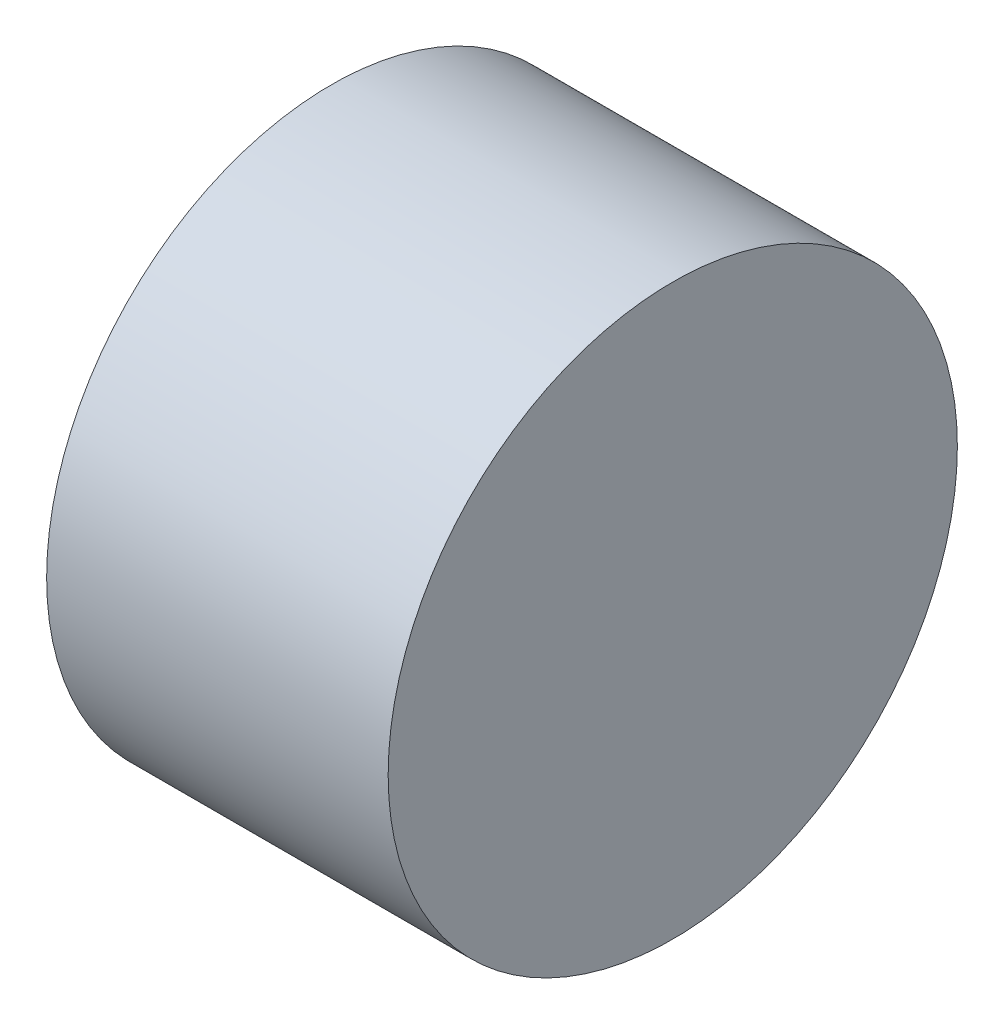
ISO-10303-21;
HEADER;
FILE_DESCRIPTION(('STEP AP214'),'2;1');
FILE_NAME('part.step','',(''),(''),'','','');
FILE_SCHEMA(('AUTOMOTIVE_DESIGN { 1 0 10303 214 1 1 1 1 }'));
ENDSEC;
DATA;
#1=APPLICATION_CONTEXT('core data for automotive mechanical design processes');
#2=APPLICATION_PROTOCOL_DEFINITION('international standard','automotive_design',2000,#1);
#3=PRODUCT_CONTEXT('',#1,'mechanical');
#4=PRODUCT('Part','Part','',(#3));
#5=PRODUCT_RELATED_PRODUCT_CATEGORY('part','',(#4));
#6=PRODUCT_DEFINITION_FORMATION('','',#4);
#7=PRODUCT_DEFINITION_CONTEXT('part definition',#1,'design');
#8=PRODUCT_DEFINITION('design','',#6,#7);
#9=PRODUCT_DEFINITION_SHAPE('','',#8);
#10=(LENGTH_UNIT() NAMED_UNIT(*) SI_UNIT(.MILLI.,.METRE.));
#11=(NAMED_UNIT(*) PLANE_ANGLE_UNIT() SI_UNIT($,.RADIAN.));
#12=(NAMED_UNIT(*) SI_UNIT($,.STERADIAN.) SOLID_ANGLE_UNIT());
#13=UNCERTAINTY_MEASURE_WITH_UNIT(LENGTH_MEASURE(1.E-05),#10,'distance_accuracy_value','');
#14=(GEOMETRIC_REPRESENTATION_CONTEXT(3) GLOBAL_UNCERTAINTY_ASSIGNED_CONTEXT((#13)) GLOBAL_UNIT_ASSIGNED_CONTEXT((#10,
#11,#12)) REPRESENTATION_CONTEXT('',''));
#15=CARTESIAN_POINT('',(0.,0.,0.));
#16=DIRECTION('',(0.,0.,1.));
#17=DIRECTION('',(1.,0.,0.));
#18=AXIS2_PLACEMENT_3D('',#15,#16,#17);
#19=CARTESIAN_POINT('',(9.,0.,0.));
#20=DIRECTION('',(-1.,0.,0.));
#21=DIRECTION('',(0.,0.,1.));
#22=AXIS2_PLACEMENT_3D('',#19,#20,#21);
#23=CYLINDRICAL_SURFACE('',#22,2.5);
#24=CARTESIAN_POINT('',(9.,0.,0.));
#25=DIRECTION('',(1.,0.,0.));
#26=DIRECTION('',(0.,0.,-1.));
#27=AXIS2_PLACEMENT_3D('',#24,#25,#26);
#28=CIRCLE('',#27,2.5);
#29=CARTESIAN_POINT('',(9.,0.,-2.5));
#30=VERTEX_POINT('',#29);
#31=EDGE_CURVE('E11',#30,#30,#28,.T.);
#32=ORIENTED_EDGE('',*,*,#31,.F.);
#33=EDGE_LOOP('',(#32));
#34=FACE_BOUND('',#33,.T.);
#35=CARTESIAN_POINT('',(6.,0.,0.));
#36=DIRECTION('',(1.,0.,0.));
#37=DIRECTION('',(0.,0.,-1.));
#38=AXIS2_PLACEMENT_3D('',#35,#36,#37);
#39=CIRCLE('',#38,2.5);
#40=CARTESIAN_POINT('',(6.,0.,-2.5));
#41=VERTEX_POINT('',#40);
#42=EDGE_CURVE('E48',#41,#41,#39,.T.);
#43=ORIENTED_EDGE('',*,*,#42,.T.);
#44=EDGE_LOOP('',(#43));
#45=FACE_BOUND('',#44,.T.);
#46=ADVANCED_FACE('F41',(#34,#45),#23,.T.);
#47=CARTESIAN_POINT('',(9.,0.,0.));
#48=DIRECTION('',(1.,0.,0.));
#49=DIRECTION('',(0.,0.,-1.));
#50=AXIS2_PLACEMENT_3D('',#47,#48,#49);
#51=PLANE('',#50);
#52=ORIENTED_EDGE('',*,*,#31,.T.);
#53=EDGE_LOOP('',(#52));
#54=FACE_BOUND('',#53,.T.);
#55=ADVANCED_FACE('F68',(#54),#51,.T.);
#56=CARTESIAN_POINT('',(6.,0.,0.));
#57=DIRECTION('',(1.,0.,0.));
#58=DIRECTION('',(0.,0.,-1.));
#59=AXIS2_PLACEMENT_3D('',#56,#57,#58);
#60=PLANE('',#59);
#61=CARTESIAN_POINT('',(6.,0.,0.));
#62=DIRECTION('',(-1.,0.,0.));
#63=DIRECTION('',(0.,0.,1.));
#64=AXIS2_PLACEMENT_3D('',#61,#62,#63);
#65=CIRCLE('',#64,1.456);
#66=CARTESIAN_POINT('',(6.,0.,1.456));
#67=VERTEX_POINT('',#66);
#68=EDGE_CURVE('E56',#67,#67,#65,.T.);
#69=ORIENTED_EDGE('',*,*,#68,.F.);
#70=EDGE_LOOP('',(#69));
#71=FACE_BOUND('',#70,.T.);
#72=ORIENTED_EDGE('',*,*,#42,.F.);
#73=EDGE_LOOP('',(#72));
#74=FACE_BOUND('',#73,.T.);
#75=ADVANCED_FACE('F65',(#71,#74),#60,.F.);
#76=CARTESIAN_POINT('',(13.1181898936305,0.,0.));
#77=DIRECTION('',(-1.,0.,0.));
#78=DIRECTION('',(0.,0.,1.));
#79=AXIS2_PLACEMENT_3D('',#76,#77,#78);
#80=CYLINDRICAL_SURFACE('',#79,1.456);
#81=ORIENTED_EDGE('',*,*,#68,.T.);
#82=EDGE_LOOP('',(#81));
#83=FACE_BOUND('',#82,.T.);
#84=CARTESIAN_POINT('',(8.,0.,0.));
#85=DIRECTION('',(1.,0.,0.));
#86=DIRECTION('',(0.,0.,-1.));
#87=AXIS2_PLACEMENT_3D('',#84,#85,#86);
#88=CIRCLE('',#87,1.456);
#89=CARTESIAN_POINT('',(8.,0.,-1.456));
#90=VERTEX_POINT('',#89);
#91=EDGE_CURVE('E52',#90,#90,#88,.F.);
#92=ORIENTED_EDGE('',*,*,#91,.F.);
#93=EDGE_LOOP('',(#92));
#94=FACE_BOUND('',#93,.T.);
#95=ADVANCED_FACE('F62',(#83,#94),#80,.F.);
#96=CARTESIAN_POINT('',(8.,0.,0.));
#97=DIRECTION('',(1.,0.,0.));
#98=DIRECTION('',(0.,0.,-1.));
#99=AXIS2_PLACEMENT_3D('',#96,#97,#98);
#100=PLANE('',#99);
#101=ORIENTED_EDGE('',*,*,#91,.T.);
#102=EDGE_LOOP('',(#101));
#103=FACE_BOUND('',#102,.T.);
#104=ADVANCED_FACE('F43',(#103),#100,.F.);
#105=CLOSED_SHELL('',(#46,#55,#75,#95,#104));
#106=MANIFOLD_SOLID_BREP('B2',#105);
#107=ADVANCED_BREP_SHAPE_REPRESENTATION('',(#18,#106),#14);
#108=SHAPE_DEFINITION_REPRESENTATION(#9,#107);
ENDSEC;
END-ISO-10303-21;
